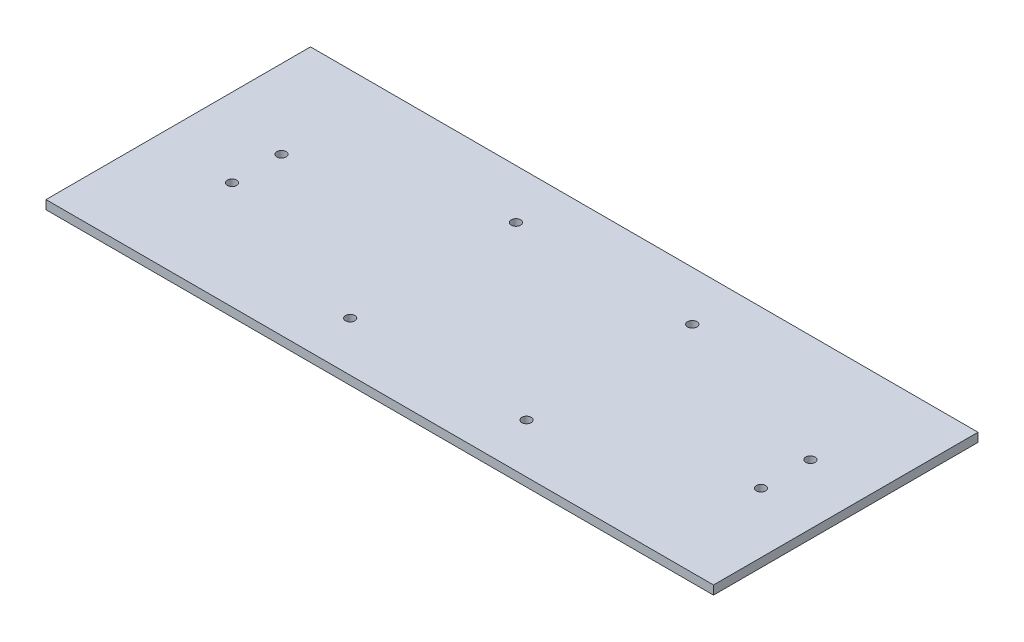
ISO-10303-21;
HEADER;
FILE_DESCRIPTION(('STEP AP214'),'2;1');
FILE_NAME('part.step','',(''),(''),'','','');
FILE_SCHEMA(('AUTOMOTIVE_DESIGN { 1 0 10303 214 1 1 1 1 }'));
ENDSEC;
DATA;
#1=APPLICATION_CONTEXT('core data for automotive mechanical design processes');
#2=APPLICATION_PROTOCOL_DEFINITION('international standard','automotive_design',2000,#1);
#3=PRODUCT_CONTEXT('',#1,'mechanical');
#4=PRODUCT('Part','Part','',(#3));
#5=PRODUCT_RELATED_PRODUCT_CATEGORY('part','',(#4));
#6=PRODUCT_DEFINITION_FORMATION('','',#4);
#7=PRODUCT_DEFINITION_CONTEXT('part definition',#1,'design');
#8=PRODUCT_DEFINITION('design','',#6,#7);
#9=PRODUCT_DEFINITION_SHAPE('','',#8);
#10=(LENGTH_UNIT() NAMED_UNIT(*) SI_UNIT(.MILLI.,.METRE.));
#11=(NAMED_UNIT(*) PLANE_ANGLE_UNIT() SI_UNIT($,.RADIAN.));
#12=(NAMED_UNIT(*) SI_UNIT($,.STERADIAN.) SOLID_ANGLE_UNIT());
#13=UNCERTAINTY_MEASURE_WITH_UNIT(LENGTH_MEASURE(1.E-05),#10,'distance_accuracy_value','');
#14=(GEOMETRIC_REPRESENTATION_CONTEXT(3) GLOBAL_UNCERTAINTY_ASSIGNED_CONTEXT((#13)) GLOBAL_UNIT_ASSIGNED_CONTEXT((#10,
#11,#12)) REPRESENTATION_CONTEXT('',''));
#15=CARTESIAN_POINT('',(0.,0.,0.));
#16=DIRECTION('',(0.,0.,1.));
#17=DIRECTION('',(1.,0.,0.));
#18=AXIS2_PLACEMENT_3D('',#15,#16,#17);
#19=CARTESIAN_POINT('',(0.,5.,0.));
#20=DIRECTION('',(0.,-1.,0.));
#21=DIRECTION('',(0.,0.,-1.));
#22=AXIS2_PLACEMENT_3D('',#19,#20,#21);
#23=PLANE('',#22);
#24=DIRECTION('',(0.,0.,1.));
#25=VECTOR('',#24,1.);
#26=CARTESIAN_POINT('',(0.,5.,-8.49999999999998));
#27=LINE('',#26,#25);
#28=CARTESIAN_POINT('',(0.,5.,-158.5));
#29=VERTEX_POINT('',#28);
#30=CARTESIAN_POINT('',(0.,5.,-8.49999999999998));
#31=VERTEX_POINT('',#30);
#32=EDGE_CURVE('E84',#29,#31,#27,.T.);
#33=ORIENTED_EDGE('',*,*,#32,.T.);
#34=DIRECTION('',(1.,0.,0.));
#35=VECTOR('',#34,1.);
#36=CARTESIAN_POINT('',(0.,5.,-8.49999999999998));
#37=LINE('',#36,#35);
#38=CARTESIAN_POINT('',(378.54,5.,-8.49999999999998));
#39=VERTEX_POINT('',#38);
#40=EDGE_CURVE('E79',#31,#39,#37,.T.);
#41=ORIENTED_EDGE('',*,*,#40,.T.);
#42=DIRECTION('',(0.,0.,-1.));
#43=VECTOR('',#42,1.);
#44=CARTESIAN_POINT('',(378.54,5.,-8.49999999999998));
#45=LINE('',#44,#43);
#46=CARTESIAN_POINT('',(378.54,5.,-158.5));
#47=VERTEX_POINT('',#46);
#48=EDGE_CURVE('E82',#39,#47,#45,.T.);
#49=ORIENTED_EDGE('',*,*,#48,.T.);
#50=DIRECTION('',(-1.,0.,0.));
#51=VECTOR('',#50,1.);
#52=CARTESIAN_POINT('',(0.,5.,-158.5));
#53=LINE('',#52,#51);
#54=EDGE_CURVE('E49',#47,#29,#53,.T.);
#55=ORIENTED_EDGE('',*,*,#54,.T.);
#56=EDGE_LOOP('',(#33,#41,#49,#55));
#57=FACE_BOUND('',#56,.T.);
#58=CARTESIAN_POINT('',(144.5,5.,-36.5));
#59=DIRECTION('',(0.,1.,0.));
#60=DIRECTION('',(0.,0.,1.));
#61=AXIS2_PLACEMENT_3D('',#58,#59,#60);
#62=CIRCLE('',#61,2.65000000000002);
#63=CARTESIAN_POINT('',(144.5,5.,-33.85));
#64=VERTEX_POINT('',#63);
#65=EDGE_CURVE('E99',#64,#64,#62,.T.);
#66=ORIENTED_EDGE('',*,*,#65,.F.);
#67=EDGE_LOOP('',(#66));
#68=FACE_BOUND('',#67,.T.);
#69=CARTESIAN_POINT('',(244.5,5.,-36.5));
#70=DIRECTION('',(0.,1.,0.));
#71=DIRECTION('',(0.,0.,1.));
#72=AXIS2_PLACEMENT_3D('',#69,#70,#71);
#73=CIRCLE('',#72,2.65000000000002);
#74=CARTESIAN_POINT('',(244.5,5.,-33.85));
#75=VERTEX_POINT('',#74);
#76=EDGE_CURVE('E114',#75,#75,#73,.T.);
#77=ORIENTED_EDGE('',*,*,#76,.F.);
#78=EDGE_LOOP('',(#77));
#79=FACE_BOUND('',#78,.T.);
#80=CARTESIAN_POINT('',(344.5,5.,-69.5));
#81=DIRECTION('',(0.,1.,0.));
#82=DIRECTION('',(0.,0.,1.));
#83=AXIS2_PLACEMENT_3D('',#80,#81,#82);
#84=CIRCLE('',#83,2.64999999999999);
#85=CARTESIAN_POINT('',(344.5,5.,-66.85));
#86=VERTEX_POINT('',#85);
#87=EDGE_CURVE('E120',#86,#86,#84,.T.);
#88=ORIENTED_EDGE('',*,*,#87,.F.);
#89=EDGE_LOOP('',(#88));
#90=FACE_BOUND('',#89,.T.);
#91=CARTESIAN_POINT('',(344.5,5.,-97.5));
#92=DIRECTION('',(0.,1.,0.));
#93=DIRECTION('',(0.,0.,-1.));
#94=AXIS2_PLACEMENT_3D('',#91,#92,#93);
#95=CIRCLE('',#94,2.64999999999999);
#96=CARTESIAN_POINT('',(344.5,5.,-100.15));
#97=VERTEX_POINT('',#96);
#98=EDGE_CURVE('E126',#97,#97,#95,.T.);
#99=ORIENTED_EDGE('',*,*,#98,.F.);
#100=EDGE_LOOP('',(#99));
#101=FACE_BOUND('',#100,.T.);
#102=CARTESIAN_POINT('',(244.5,5.,-130.5));
#103=DIRECTION('',(0.,1.,0.));
#104=DIRECTION('',(0.,0.,-1.));
#105=AXIS2_PLACEMENT_3D('',#102,#103,#104);
#106=CIRCLE('',#105,2.65000000000002);
#107=CARTESIAN_POINT('',(244.5,5.,-133.15));
#108=VERTEX_POINT('',#107);
#109=EDGE_CURVE('E132',#108,#108,#106,.T.);
#110=ORIENTED_EDGE('',*,*,#109,.F.);
#111=EDGE_LOOP('',(#110));
#112=FACE_BOUND('',#111,.T.);
#113=CARTESIAN_POINT('',(44.5,5.,-69.5));
#114=DIRECTION('',(0.,1.,0.));
#115=DIRECTION('',(0.,0.,1.));
#116=AXIS2_PLACEMENT_3D('',#113,#114,#115);
#117=CIRCLE('',#116,2.65);
#118=CARTESIAN_POINT('',(44.5,5.,-66.85));
#119=VERTEX_POINT('',#118);
#120=EDGE_CURVE('E138',#119,#119,#117,.T.);
#121=ORIENTED_EDGE('',*,*,#120,.F.);
#122=EDGE_LOOP('',(#121));
#123=FACE_BOUND('',#122,.T.);
#124=CARTESIAN_POINT('',(144.5,5.,-130.5));
#125=DIRECTION('',(0.,1.,0.));
#126=DIRECTION('',(0.,0.,-1.));
#127=AXIS2_PLACEMENT_3D('',#124,#125,#126);
#128=CIRCLE('',#127,2.65000000000002);
#129=CARTESIAN_POINT('',(144.5,5.,-133.15));
#130=VERTEX_POINT('',#129);
#131=EDGE_CURVE('E144',#130,#130,#128,.T.);
#132=ORIENTED_EDGE('',*,*,#131,.F.);
#133=EDGE_LOOP('',(#132));
#134=FACE_BOUND('',#133,.T.);
#135=CARTESIAN_POINT('',(44.5,5.,-97.5));
#136=DIRECTION('',(0.,1.,0.));
#137=DIRECTION('',(0.,0.,-1.));
#138=AXIS2_PLACEMENT_3D('',#135,#136,#137);
#139=CIRCLE('',#138,2.65);
#140=CARTESIAN_POINT('',(44.5,5.,-100.15));
#141=VERTEX_POINT('',#140);
#142=EDGE_CURVE('E150',#141,#141,#139,.T.);
#143=ORIENTED_EDGE('',*,*,#142,.F.);
#144=EDGE_LOOP('',(#143));
#145=FACE_BOUND('',#144,.T.);
#146=ADVANCED_FACE('F32',(#57,#68,#79,#90,#101,#112,#123,#134,#145),#23,.F.);
#147=CARTESIAN_POINT('',(0.,0.,0.));
#148=DIRECTION('',(0.,-1.,0.));
#149=DIRECTION('',(0.,0.,-1.));
#150=AXIS2_PLACEMENT_3D('',#147,#148,#149);
#151=PLANE('',#150);
#152=CARTESIAN_POINT('',(144.5,0.,-130.5));
#153=DIRECTION('',(0.,1.,0.));
#154=DIRECTION('',(0.,0.,-1.));
#155=AXIS2_PLACEMENT_3D('',#152,#153,#154);
#156=CIRCLE('',#155,2.65000000000002);
#157=CARTESIAN_POINT('',(144.5,0.,-133.15));
#158=VERTEX_POINT('',#157);
#159=EDGE_CURVE('E147',#158,#158,#156,.T.);
#160=ORIENTED_EDGE('',*,*,#159,.T.);
#161=EDGE_LOOP('',(#160));
#162=FACE_BOUND('',#161,.T.);
#163=CARTESIAN_POINT('',(244.5,0.,-130.5));
#164=DIRECTION('',(0.,1.,0.));
#165=DIRECTION('',(0.,0.,-1.));
#166=AXIS2_PLACEMENT_3D('',#163,#164,#165);
#167=CIRCLE('',#166,2.65000000000002);
#168=CARTESIAN_POINT('',(244.5,0.,-133.15));
#169=VERTEX_POINT('',#168);
#170=EDGE_CURVE('E135',#169,#169,#167,.T.);
#171=ORIENTED_EDGE('',*,*,#170,.T.);
#172=EDGE_LOOP('',(#171));
#173=FACE_BOUND('',#172,.T.);
#174=CARTESIAN_POINT('',(344.5,0.,-69.5));
#175=DIRECTION('',(0.,1.,0.));
#176=DIRECTION('',(0.,0.,1.));
#177=AXIS2_PLACEMENT_3D('',#174,#175,#176);
#178=CIRCLE('',#177,2.64999999999999);
#179=CARTESIAN_POINT('',(344.5,0.,-66.85));
#180=VERTEX_POINT('',#179);
#181=EDGE_CURVE('E123',#180,#180,#178,.T.);
#182=ORIENTED_EDGE('',*,*,#181,.T.);
#183=EDGE_LOOP('',(#182));
#184=FACE_BOUND('',#183,.T.);
#185=CARTESIAN_POINT('',(144.5,0.,-36.5));
#186=DIRECTION('',(0.,1.,0.));
#187=DIRECTION('',(0.,0.,1.));
#188=AXIS2_PLACEMENT_3D('',#185,#186,#187);
#189=CIRCLE('',#188,2.65000000000002);
#190=CARTESIAN_POINT('',(144.5,0.,-33.85));
#191=VERTEX_POINT('',#190);
#192=EDGE_CURVE('E111',#191,#191,#189,.T.);
#193=ORIENTED_EDGE('',*,*,#192,.T.);
#194=EDGE_LOOP('',(#193));
#195=FACE_BOUND('',#194,.T.);
#196=DIRECTION('',(0.,0.,1.));
#197=VECTOR('',#196,1.);
#198=CARTESIAN_POINT('',(0.,0.,-8.49999999999998));
#199=LINE('',#198,#197);
#200=CARTESIAN_POINT('',(0.,0.,-158.5));
#201=VERTEX_POINT('',#200);
#202=CARTESIAN_POINT('',(0.,0.,-8.49999999999998));
#203=VERTEX_POINT('',#202);
#204=EDGE_CURVE('E96',#201,#203,#199,.T.);
#205=ORIENTED_EDGE('',*,*,#204,.F.);
#206=DIRECTION('',(-1.,0.,0.));
#207=VECTOR('',#206,1.);
#208=CARTESIAN_POINT('',(0.,0.,-158.5));
#209=LINE('',#208,#207);
#210=CARTESIAN_POINT('',(378.54,0.,-158.5));
#211=VERTEX_POINT('',#210);
#212=EDGE_CURVE('E72',#211,#201,#209,.T.);
#213=ORIENTED_EDGE('',*,*,#212,.F.);
#214=DIRECTION('',(0.,0.,-1.));
#215=VECTOR('',#214,1.);
#216=CARTESIAN_POINT('',(378.54,0.,-8.49999999999998));
#217=LINE('',#216,#215);
#218=CARTESIAN_POINT('',(378.54,0.,-8.49999999999998));
#219=VERTEX_POINT('',#218);
#220=EDGE_CURVE('E66',#219,#211,#217,.T.);
#221=ORIENTED_EDGE('',*,*,#220,.F.);
#222=DIRECTION('',(1.,0.,0.));
#223=VECTOR('',#222,1.);
#224=CARTESIAN_POINT('',(0.,0.,-8.49999999999998));
#225=LINE('',#224,#223);
#226=EDGE_CURVE('E88',#203,#219,#225,.T.);
#227=ORIENTED_EDGE('',*,*,#226,.F.);
#228=EDGE_LOOP('',(#205,#213,#221,#227));
#229=FACE_BOUND('',#228,.T.);
#230=CARTESIAN_POINT('',(244.5,0.,-36.5));
#231=DIRECTION('',(0.,1.,0.));
#232=DIRECTION('',(0.,0.,1.));
#233=AXIS2_PLACEMENT_3D('',#230,#231,#232);
#234=CIRCLE('',#233,2.65000000000002);
#235=CARTESIAN_POINT('',(244.5,0.,-33.85));
#236=VERTEX_POINT('',#235);
#237=EDGE_CURVE('E117',#236,#236,#234,.T.);
#238=ORIENTED_EDGE('',*,*,#237,.T.);
#239=EDGE_LOOP('',(#238));
#240=FACE_BOUND('',#239,.T.);
#241=CARTESIAN_POINT('',(344.5,0.,-97.5));
#242=DIRECTION('',(0.,1.,0.));
#243=DIRECTION('',(0.,0.,-1.));
#244=AXIS2_PLACEMENT_3D('',#241,#242,#243);
#245=CIRCLE('',#244,2.64999999999999);
#246=CARTESIAN_POINT('',(344.5,0.,-100.15));
#247=VERTEX_POINT('',#246);
#248=EDGE_CURVE('E129',#247,#247,#245,.T.);
#249=ORIENTED_EDGE('',*,*,#248,.T.);
#250=EDGE_LOOP('',(#249));
#251=FACE_BOUND('',#250,.T.);
#252=CARTESIAN_POINT('',(44.5,0.,-69.5));
#253=DIRECTION('',(0.,1.,0.));
#254=DIRECTION('',(0.,0.,1.));
#255=AXIS2_PLACEMENT_3D('',#252,#253,#254);
#256=CIRCLE('',#255,2.65);
#257=CARTESIAN_POINT('',(44.5,0.,-66.85));
#258=VERTEX_POINT('',#257);
#259=EDGE_CURVE('E141',#258,#258,#256,.T.);
#260=ORIENTED_EDGE('',*,*,#259,.T.);
#261=EDGE_LOOP('',(#260));
#262=FACE_BOUND('',#261,.T.);
#263=CARTESIAN_POINT('',(44.5,0.,-97.5));
#264=DIRECTION('',(0.,1.,0.));
#265=DIRECTION('',(0.,0.,-1.));
#266=AXIS2_PLACEMENT_3D('',#263,#264,#265);
#267=CIRCLE('',#266,2.65);
#268=CARTESIAN_POINT('',(44.5,0.,-100.15));
#269=VERTEX_POINT('',#268);
#270=EDGE_CURVE('E153',#269,#269,#267,.T.);
#271=ORIENTED_EDGE('',*,*,#270,.T.);
#272=EDGE_LOOP('',(#271));
#273=FACE_BOUND('',#272,.T.);
#274=ADVANCED_FACE('F107',(#162,#173,#184,#195,#229,#240,#251,#262,#273),#151,.T.);
#275=CARTESIAN_POINT('',(0.,5.,-8.49999999999998));
#276=DIRECTION('',(1.,0.,0.));
#277=DIRECTION('',(0.,0.,-1.));
#278=AXIS2_PLACEMENT_3D('',#275,#276,#277);
#279=PLANE('',#278);
#280=ORIENTED_EDGE('',*,*,#204,.T.);
#281=DIRECTION('',(0.,-1.,0.));
#282=VECTOR('',#281,1.);
#283=CARTESIAN_POINT('',(0.,5.,-8.49999999999998));
#284=LINE('',#283,#282);
#285=EDGE_CURVE('E11',#31,#203,#284,.T.);
#286=ORIENTED_EDGE('',*,*,#285,.F.);
#287=ORIENTED_EDGE('',*,*,#32,.F.);
#288=DIRECTION('',(0.,-1.,0.));
#289=VECTOR('',#288,1.);
#290=CARTESIAN_POINT('',(0.,5.,-158.5));
#291=LINE('',#290,#289);
#292=EDGE_CURVE('E92',#29,#201,#291,.T.);
#293=ORIENTED_EDGE('',*,*,#292,.T.);
#294=EDGE_LOOP('',(#280,#286,#287,#293));
#295=FACE_BOUND('',#294,.T.);
#296=ADVANCED_FACE('F34',(#295),#279,.F.);
#297=CARTESIAN_POINT('',(0.,5.,-8.49999999999998));
#298=DIRECTION('',(0.,0.,-1.));
#299=DIRECTION('',(-1.,0.,0.));
#300=AXIS2_PLACEMENT_3D('',#297,#298,#299);
#301=PLANE('',#300);
#302=ORIENTED_EDGE('',*,*,#226,.T.);
#303=DIRECTION('',(0.,-1.,0.));
#304=VECTOR('',#303,1.);
#305=CARTESIAN_POINT('',(378.54,5.,-8.49999999999998));
#306=LINE('',#305,#304);
#307=EDGE_CURVE('E41',#39,#219,#306,.T.);
#308=ORIENTED_EDGE('',*,*,#307,.F.);
#309=ORIENTED_EDGE('',*,*,#40,.F.);
#310=ORIENTED_EDGE('',*,*,#285,.T.);
#311=EDGE_LOOP('',(#302,#308,#309,#310));
#312=FACE_BOUND('',#311,.T.);
#313=ADVANCED_FACE('F87',(#312),#301,.F.);
#314=CARTESIAN_POINT('',(378.54,5.,-8.49999999999998));
#315=DIRECTION('',(-1.,0.,0.));
#316=DIRECTION('',(0.,0.,1.));
#317=AXIS2_PLACEMENT_3D('',#314,#315,#316);
#318=PLANE('',#317);
#319=ORIENTED_EDGE('',*,*,#220,.T.);
#320=DIRECTION('',(0.,-1.,0.));
#321=VECTOR('',#320,1.);
#322=CARTESIAN_POINT('',(378.54,5.,-158.5));
#323=LINE('',#322,#321);
#324=EDGE_CURVE('E89',#47,#211,#323,.T.);
#325=ORIENTED_EDGE('',*,*,#324,.F.);
#326=ORIENTED_EDGE('',*,*,#48,.F.);
#327=ORIENTED_EDGE('',*,*,#307,.T.);
#328=EDGE_LOOP('',(#319,#325,#326,#327));
#329=FACE_BOUND('',#328,.T.);
#330=ADVANCED_FACE('F90',(#329),#318,.F.);
#331=CARTESIAN_POINT('',(0.,5.,-158.5));
#332=DIRECTION('',(0.,0.,1.));
#333=DIRECTION('',(1.,0.,0.));
#334=AXIS2_PLACEMENT_3D('',#331,#332,#333);
#335=PLANE('',#334);
#336=ORIENTED_EDGE('',*,*,#212,.T.);
#337=ORIENTED_EDGE('',*,*,#292,.F.);
#338=ORIENTED_EDGE('',*,*,#54,.F.);
#339=ORIENTED_EDGE('',*,*,#324,.T.);
#340=EDGE_LOOP('',(#336,#337,#338,#339));
#341=FACE_BOUND('',#340,.T.);
#342=ADVANCED_FACE('F104',(#341),#335,.F.);
#343=CARTESIAN_POINT('',(144.5,5.,-36.5));
#344=DIRECTION('',(0.,-1.,0.));
#345=DIRECTION('',(0.,0.,-1.));
#346=AXIS2_PLACEMENT_3D('',#343,#344,#345);
#347=CYLINDRICAL_SURFACE('',#346,2.65000000000002);
#348=ORIENTED_EDGE('',*,*,#65,.T.);
#349=EDGE_LOOP('',(#348));
#350=FACE_BOUND('',#349,.T.);
#351=ORIENTED_EDGE('',*,*,#192,.F.);
#352=EDGE_LOOP('',(#351));
#353=FACE_BOUND('',#352,.T.);
#354=ADVANCED_FACE('F170',(#350,#353),#347,.F.);
#355=CARTESIAN_POINT('',(244.5,5.,-36.5));
#356=DIRECTION('',(0.,-1.,0.));
#357=DIRECTION('',(0.,0.,-1.));
#358=AXIS2_PLACEMENT_3D('',#355,#356,#357);
#359=CYLINDRICAL_SURFACE('',#358,2.65000000000002);
#360=ORIENTED_EDGE('',*,*,#76,.T.);
#361=EDGE_LOOP('',(#360));
#362=FACE_BOUND('',#361,.T.);
#363=ORIENTED_EDGE('',*,*,#237,.F.);
#364=EDGE_LOOP('',(#363));
#365=FACE_BOUND('',#364,.T.);
#366=ADVANCED_FACE('F216',(#362,#365),#359,.F.);
#367=CARTESIAN_POINT('',(344.5,5.,-69.5));
#368=DIRECTION('',(0.,-1.,0.));
#369=DIRECTION('',(0.,0.,-1.));
#370=AXIS2_PLACEMENT_3D('',#367,#368,#369);
#371=CYLINDRICAL_SURFACE('',#370,2.64999999999999);
#372=ORIENTED_EDGE('',*,*,#87,.T.);
#373=EDGE_LOOP('',(#372));
#374=FACE_BOUND('',#373,.T.);
#375=ORIENTED_EDGE('',*,*,#181,.F.);
#376=EDGE_LOOP('',(#375));
#377=FACE_BOUND('',#376,.T.);
#378=ADVANCED_FACE('F224',(#374,#377),#371,.F.);
#379=CARTESIAN_POINT('',(344.5,5.,-97.5));
#380=DIRECTION('',(0.,-1.,0.));
#381=DIRECTION('',(0.,0.,-1.));
#382=AXIS2_PLACEMENT_3D('',#379,#380,#381);
#383=CYLINDRICAL_SURFACE('',#382,2.64999999999999);
#384=ORIENTED_EDGE('',*,*,#98,.T.);
#385=EDGE_LOOP('',(#384));
#386=FACE_BOUND('',#385,.T.);
#387=ORIENTED_EDGE('',*,*,#248,.F.);
#388=EDGE_LOOP('',(#387));
#389=FACE_BOUND('',#388,.T.);
#390=ADVANCED_FACE('F232',(#386,#389),#383,.F.);
#391=CARTESIAN_POINT('',(244.5,5.,-130.5));
#392=DIRECTION('',(0.,-1.,0.));
#393=DIRECTION('',(0.,0.,-1.));
#394=AXIS2_PLACEMENT_3D('',#391,#392,#393);
#395=CYLINDRICAL_SURFACE('',#394,2.65000000000002);
#396=ORIENTED_EDGE('',*,*,#109,.T.);
#397=EDGE_LOOP('',(#396));
#398=FACE_BOUND('',#397,.T.);
#399=ORIENTED_EDGE('',*,*,#170,.F.);
#400=EDGE_LOOP('',(#399));
#401=FACE_BOUND('',#400,.T.);
#402=ADVANCED_FACE('F241',(#398,#401),#395,.F.);
#403=CARTESIAN_POINT('',(44.5,5.,-69.5));
#404=DIRECTION('',(0.,-1.,0.));
#405=DIRECTION('',(0.,0.,-1.));
#406=AXIS2_PLACEMENT_3D('',#403,#404,#405);
#407=CYLINDRICAL_SURFACE('',#406,2.65);
#408=ORIENTED_EDGE('',*,*,#120,.T.);
#409=EDGE_LOOP('',(#408));
#410=FACE_BOUND('',#409,.T.);
#411=ORIENTED_EDGE('',*,*,#259,.F.);
#412=EDGE_LOOP('',(#411));
#413=FACE_BOUND('',#412,.T.);
#414=ADVANCED_FACE('F250',(#410,#413),#407,.F.);
#415=CARTESIAN_POINT('',(144.5,5.,-130.5));
#416=DIRECTION('',(0.,-1.,0.));
#417=DIRECTION('',(0.,0.,-1.));
#418=AXIS2_PLACEMENT_3D('',#415,#416,#417);
#419=CYLINDRICAL_SURFACE('',#418,2.65000000000002);
#420=ORIENTED_EDGE('',*,*,#131,.T.);
#421=EDGE_LOOP('',(#420));
#422=FACE_BOUND('',#421,.T.);
#423=ORIENTED_EDGE('',*,*,#159,.F.);
#424=EDGE_LOOP('',(#423));
#425=FACE_BOUND('',#424,.T.);
#426=ADVANCED_FACE('F259',(#422,#425),#419,.F.);
#427=CARTESIAN_POINT('',(44.5,5.,-97.5));
#428=DIRECTION('',(0.,-1.,0.));
#429=DIRECTION('',(0.,0.,-1.));
#430=AXIS2_PLACEMENT_3D('',#427,#428,#429);
#431=CYLINDRICAL_SURFACE('',#430,2.65);
#432=ORIENTED_EDGE('',*,*,#142,.T.);
#433=EDGE_LOOP('',(#432));
#434=FACE_BOUND('',#433,.T.);
#435=ORIENTED_EDGE('',*,*,#270,.F.);
#436=EDGE_LOOP('',(#435));
#437=FACE_BOUND('',#436,.T.);
#438=ADVANCED_FACE('F159',(#434,#437),#431,.F.);
#439=CLOSED_SHELL('',(#146,#274,#296,#313,#330,#342,#354,#366,#378,#390,#402,#414,#426,#438));
#440=MANIFOLD_SOLID_BREP('B2',#439);
#441=ADVANCED_BREP_SHAPE_REPRESENTATION('',(#18,#440),#14);
#442=SHAPE_DEFINITION_REPRESENTATION(#9,#441);
ENDSEC;
END-ISO-10303-21;
